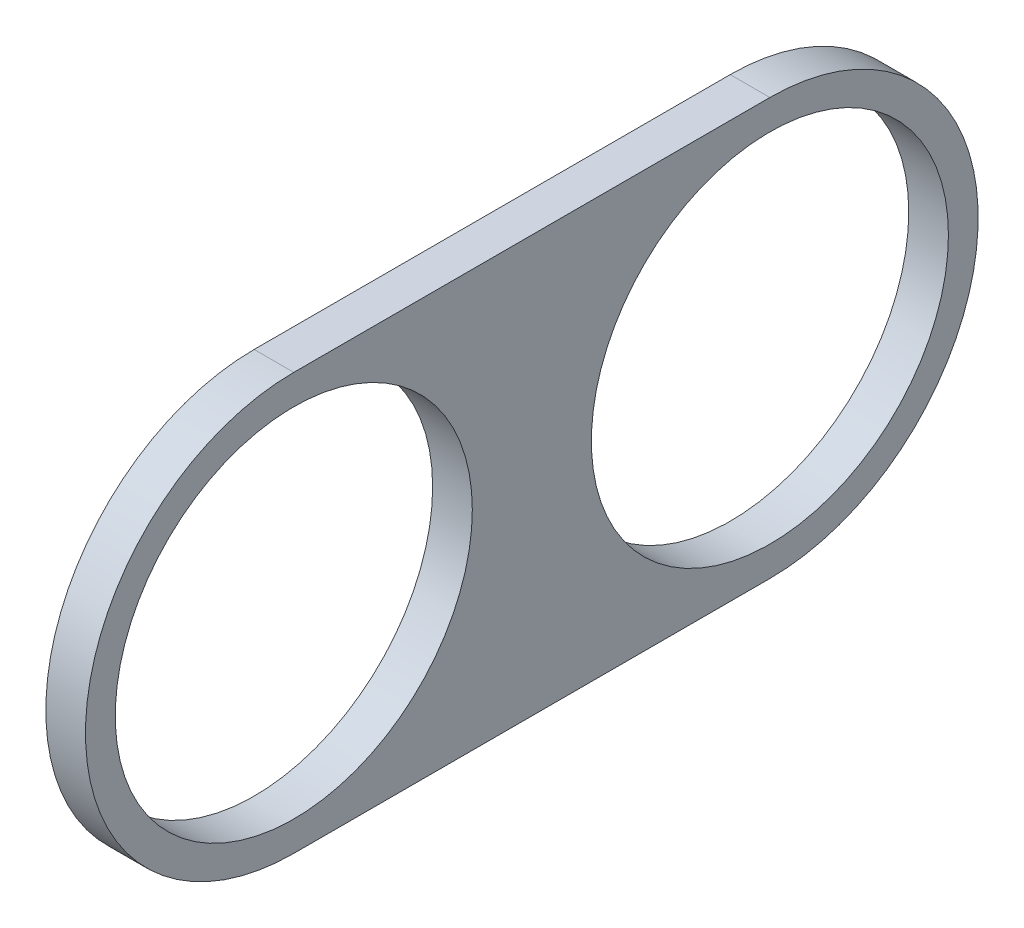
ISO-10303-21;
HEADER;
FILE_DESCRIPTION(('STEP AP214'),'2;1');
FILE_NAME('part.step','',(''),(''),'','','');
FILE_SCHEMA(('AUTOMOTIVE_DESIGN { 1 0 10303 214 1 1 1 1 }'));
ENDSEC;
DATA;
#1=APPLICATION_CONTEXT('core data for automotive mechanical design processes');
#2=APPLICATION_PROTOCOL_DEFINITION('international standard','automotive_design',2000,#1);
#3=PRODUCT_CONTEXT('',#1,'mechanical');
#4=PRODUCT('Part','Part','',(#3));
#5=PRODUCT_RELATED_PRODUCT_CATEGORY('part','',(#4));
#6=PRODUCT_DEFINITION_FORMATION('','',#4);
#7=PRODUCT_DEFINITION_CONTEXT('part definition',#1,'design');
#8=PRODUCT_DEFINITION('design','',#6,#7);
#9=PRODUCT_DEFINITION_SHAPE('','',#8);
#10=(LENGTH_UNIT() NAMED_UNIT(*) SI_UNIT(.MILLI.,.METRE.));
#11=(NAMED_UNIT(*) PLANE_ANGLE_UNIT() SI_UNIT($,.RADIAN.));
#12=(NAMED_UNIT(*) SI_UNIT($,.STERADIAN.) SOLID_ANGLE_UNIT());
#13=UNCERTAINTY_MEASURE_WITH_UNIT(LENGTH_MEASURE(1.E-05),#10,'distance_accuracy_value','');
#14=(GEOMETRIC_REPRESENTATION_CONTEXT(3) GLOBAL_UNCERTAINTY_ASSIGNED_CONTEXT((#13)) GLOBAL_UNIT_ASSIGNED_CONTEXT((#10,
#11,#12)) REPRESENTATION_CONTEXT('',''));
#15=CARTESIAN_POINT('',(0.,0.,0.));
#16=DIRECTION('',(0.,0.,1.));
#17=DIRECTION('',(1.,0.,0.));
#18=AXIS2_PLACEMENT_3D('',#15,#16,#17);
#19=CARTESIAN_POINT('',(3.175,0.,19.05));
#20=DIRECTION('',(1.,0.,0.));
#21=DIRECTION('',(0.,0.,-1.));
#22=AXIS2_PLACEMENT_3D('',#19,#20,#21);
#23=PLANE('',#22);
#24=CARTESIAN_POINT('',(3.175,0.,-19.05));
#25=DIRECTION('',(1.,0.,0.));
#26=DIRECTION('',(0.,0.,-1.));
#27=AXIS2_PLACEMENT_3D('',#24,#25,#26);
#28=CIRCLE('',#27,14.2875);
#29=CARTESIAN_POINT('',(3.175,0.,-33.3375));
#30=VERTEX_POINT('',#29);
#31=EDGE_CURVE('E109',#30,#30,#28,.T.);
#32=ORIENTED_EDGE('',*,*,#31,.F.);
#33=EDGE_LOOP('',(#32));
#34=FACE_BOUND('',#33,.T.);
#35=CARTESIAN_POINT('',(3.175,0.,19.05));
#36=DIRECTION('',(1.,0.,0.));
#37=DIRECTION('',(0.,0.,-1.));
#38=AXIS2_PLACEMENT_3D('',#35,#36,#37);
#39=CIRCLE('',#38,16.66875);
#40=CARTESIAN_POINT('',(3.175,16.66875,19.05));
#41=VERTEX_POINT('',#40);
#42=CARTESIAN_POINT('',(3.175,-16.66875,19.05));
#43=VERTEX_POINT('',#42);
#44=EDGE_CURVE('E94',#41,#43,#39,.T.);
#45=ORIENTED_EDGE('',*,*,#44,.T.);
#46=DIRECTION('',(0.,0.,-1.));
#47=VECTOR('',#46,1.);
#48=CARTESIAN_POINT('',(3.175,-16.66875,19.05));
#49=LINE('',#48,#47);
#50=CARTESIAN_POINT('',(3.175,-16.66875,-19.05));
#51=VERTEX_POINT('',#50);
#52=EDGE_CURVE('E89',#43,#51,#49,.T.);
#53=ORIENTED_EDGE('',*,*,#52,.T.);
#54=CARTESIAN_POINT('',(3.175,0.,-19.05));
#55=DIRECTION('',(1.,0.,0.));
#56=DIRECTION('',(0.,0.,-1.));
#57=AXIS2_PLACEMENT_3D('',#54,#55,#56);
#58=CIRCLE('',#57,16.66875);
#59=CARTESIAN_POINT('',(3.175,16.66875,-19.05));
#60=VERTEX_POINT('',#59);
#61=EDGE_CURVE('E92',#51,#60,#58,.T.);
#62=ORIENTED_EDGE('',*,*,#61,.T.);
#63=DIRECTION('',(0.,0.,1.));
#64=VECTOR('',#63,1.);
#65=CARTESIAN_POINT('',(3.175,16.66875,19.05));
#66=LINE('',#65,#64);
#67=EDGE_CURVE('E59',#60,#41,#66,.T.);
#68=ORIENTED_EDGE('',*,*,#67,.T.);
#69=EDGE_LOOP('',(#45,#53,#62,#68));
#70=FACE_BOUND('',#69,.T.);
#71=CARTESIAN_POINT('',(3.175,0.,19.05));
#72=DIRECTION('',(1.,0.,0.));
#73=DIRECTION('',(0.,0.,-1.));
#74=AXIS2_PLACEMENT_3D('',#71,#72,#73);
#75=CIRCLE('',#74,14.2875);
#76=CARTESIAN_POINT('',(3.175,0.,4.76250000000001));
#77=VERTEX_POINT('',#76);
#78=EDGE_CURVE('E124',#77,#77,#75,.T.);
#79=ORIENTED_EDGE('',*,*,#78,.F.);
#80=EDGE_LOOP('',(#79));
#81=FACE_BOUND('',#80,.T.);
#82=ADVANCED_FACE('F42',(#34,#70,#81),#23,.T.);
#83=CARTESIAN_POINT('',(0.,0.,19.05));
#84=DIRECTION('',(1.,0.,0.));
#85=DIRECTION('',(0.,0.,-1.));
#86=AXIS2_PLACEMENT_3D('',#83,#84,#85);
#87=PLANE('',#86);
#88=CARTESIAN_POINT('',(0.,0.,19.05));
#89=DIRECTION('',(1.,0.,0.));
#90=DIRECTION('',(0.,0.,-1.));
#91=AXIS2_PLACEMENT_3D('',#88,#89,#90);
#92=CIRCLE('',#91,16.66875);
#93=CARTESIAN_POINT('',(0.,16.66875,19.05));
#94=VERTEX_POINT('',#93);
#95=CARTESIAN_POINT('',(0.,-16.66875,19.05));
#96=VERTEX_POINT('',#95);
#97=EDGE_CURVE('E106',#94,#96,#92,.T.);
#98=ORIENTED_EDGE('',*,*,#97,.F.);
#99=DIRECTION('',(0.,0.,1.));
#100=VECTOR('',#99,1.);
#101=CARTESIAN_POINT('',(0.,16.66875,19.05));
#102=LINE('',#101,#100);
#103=CARTESIAN_POINT('',(0.,16.66875,-19.05));
#104=VERTEX_POINT('',#103);
#105=EDGE_CURVE('E82',#104,#94,#102,.T.);
#106=ORIENTED_EDGE('',*,*,#105,.F.);
#107=CARTESIAN_POINT('',(0.,0.,-19.05));
#108=DIRECTION('',(1.,0.,0.));
#109=DIRECTION('',(0.,0.,-1.));
#110=AXIS2_PLACEMENT_3D('',#107,#108,#109);
#111=CIRCLE('',#110,16.66875);
#112=CARTESIAN_POINT('',(0.,-16.66875,-19.05));
#113=VERTEX_POINT('',#112);
#114=EDGE_CURVE('E76',#113,#104,#111,.T.);
#115=ORIENTED_EDGE('',*,*,#114,.F.);
#116=DIRECTION('',(0.,0.,-1.));
#117=VECTOR('',#116,1.);
#118=CARTESIAN_POINT('',(0.,-16.66875,19.05));
#119=LINE('',#118,#117);
#120=EDGE_CURVE('E98',#96,#113,#119,.T.);
#121=ORIENTED_EDGE('',*,*,#120,.F.);
#122=EDGE_LOOP('',(#98,#106,#115,#121));
#123=FACE_BOUND('',#122,.T.);
#124=CARTESIAN_POINT('',(0.,0.,-19.05));
#125=DIRECTION('',(1.,0.,0.));
#126=DIRECTION('',(0.,0.,-1.));
#127=AXIS2_PLACEMENT_3D('',#124,#125,#126);
#128=CIRCLE('',#127,14.2875);
#129=CARTESIAN_POINT('',(0.,0.,-33.3375));
#130=VERTEX_POINT('',#129);
#131=EDGE_CURVE('E121',#130,#130,#128,.T.);
#132=ORIENTED_EDGE('',*,*,#131,.T.);
#133=EDGE_LOOP('',(#132));
#134=FACE_BOUND('',#133,.T.);
#135=CARTESIAN_POINT('',(0.,0.,19.05));
#136=DIRECTION('',(1.,0.,0.));
#137=DIRECTION('',(0.,0.,-1.));
#138=AXIS2_PLACEMENT_3D('',#135,#136,#137);
#139=CIRCLE('',#138,14.2875);
#140=CARTESIAN_POINT('',(0.,0.,4.76250000000001));
#141=VERTEX_POINT('',#140);
#142=EDGE_CURVE('E127',#141,#141,#139,.T.);
#143=ORIENTED_EDGE('',*,*,#142,.T.);
#144=EDGE_LOOP('',(#143));
#145=FACE_BOUND('',#144,.T.);
#146=ADVANCED_FACE('F117',(#123,#134,#145),#87,.F.);
#147=CARTESIAN_POINT('',(3.175,0.,19.05));
#148=DIRECTION('',(-1.,0.,0.));
#149=DIRECTION('',(0.,0.,1.));
#150=AXIS2_PLACEMENT_3D('',#147,#148,#149);
#151=CYLINDRICAL_SURFACE('',#150,16.66875);
#152=ORIENTED_EDGE('',*,*,#97,.T.);
#153=DIRECTION('',(-1.,0.,0.));
#154=VECTOR('',#153,1.);
#155=CARTESIAN_POINT('',(3.175,-16.66875,19.05));
#156=LINE('',#155,#154);
#157=EDGE_CURVE('E11',#43,#96,#156,.T.);
#158=ORIENTED_EDGE('',*,*,#157,.F.);
#159=ORIENTED_EDGE('',*,*,#44,.F.);
#160=DIRECTION('',(-1.,0.,0.));
#161=VECTOR('',#160,1.);
#162=CARTESIAN_POINT('',(3.175,16.66875,19.05));
#163=LINE('',#162,#161);
#164=EDGE_CURVE('E102',#41,#94,#163,.T.);
#165=ORIENTED_EDGE('',*,*,#164,.T.);
#166=EDGE_LOOP('',(#152,#158,#159,#165));
#167=FACE_BOUND('',#166,.T.);
#168=ADVANCED_FACE('F44',(#167),#151,.T.);
#169=CARTESIAN_POINT('',(3.175,-16.66875,19.05));
#170=DIRECTION('',(0.,1.,0.));
#171=DIRECTION('',(0.,0.,1.));
#172=AXIS2_PLACEMENT_3D('',#169,#170,#171);
#173=PLANE('',#172);
#174=ORIENTED_EDGE('',*,*,#120,.T.);
#175=DIRECTION('',(-1.,0.,0.));
#176=VECTOR('',#175,1.);
#177=CARTESIAN_POINT('',(3.175,-16.66875,-19.05));
#178=LINE('',#177,#176);
#179=EDGE_CURVE('E51',#51,#113,#178,.T.);
#180=ORIENTED_EDGE('',*,*,#179,.F.);
#181=ORIENTED_EDGE('',*,*,#52,.F.);
#182=ORIENTED_EDGE('',*,*,#157,.T.);
#183=EDGE_LOOP('',(#174,#180,#181,#182));
#184=FACE_BOUND('',#183,.T.);
#185=ADVANCED_FACE('F97',(#184),#173,.F.);
#186=CARTESIAN_POINT('',(3.175,0.,-19.05));
#187=DIRECTION('',(-1.,0.,0.));
#188=DIRECTION('',(0.,0.,1.));
#189=AXIS2_PLACEMENT_3D('',#186,#187,#188);
#190=CYLINDRICAL_SURFACE('',#189,16.66875);
#191=ORIENTED_EDGE('',*,*,#114,.T.);
#192=DIRECTION('',(-1.,0.,0.));
#193=VECTOR('',#192,1.);
#194=CARTESIAN_POINT('',(3.175,16.66875,-19.05));
#195=LINE('',#194,#193);
#196=EDGE_CURVE('E99',#60,#104,#195,.T.);
#197=ORIENTED_EDGE('',*,*,#196,.F.);
#198=ORIENTED_EDGE('',*,*,#61,.F.);
#199=ORIENTED_EDGE('',*,*,#179,.T.);
#200=EDGE_LOOP('',(#191,#197,#198,#199));
#201=FACE_BOUND('',#200,.T.);
#202=ADVANCED_FACE('F100',(#201),#190,.T.);
#203=CARTESIAN_POINT('',(3.175,16.66875,19.05));
#204=DIRECTION('',(0.,-1.,0.));
#205=DIRECTION('',(0.,0.,-1.));
#206=AXIS2_PLACEMENT_3D('',#203,#204,#205);
#207=PLANE('',#206);
#208=ORIENTED_EDGE('',*,*,#105,.T.);
#209=ORIENTED_EDGE('',*,*,#164,.F.);
#210=ORIENTED_EDGE('',*,*,#67,.F.);
#211=ORIENTED_EDGE('',*,*,#196,.T.);
#212=EDGE_LOOP('',(#208,#209,#210,#211));
#213=FACE_BOUND('',#212,.T.);
#214=ADVANCED_FACE('F114',(#213),#207,.F.);
#215=CARTESIAN_POINT('',(3.175,0.,-19.05));
#216=DIRECTION('',(-1.,0.,0.));
#217=DIRECTION('',(0.,0.,1.));
#218=AXIS2_PLACEMENT_3D('',#215,#216,#217);
#219=CYLINDRICAL_SURFACE('',#218,14.2875);
#220=ORIENTED_EDGE('',*,*,#31,.T.);
#221=EDGE_LOOP('',(#220));
#222=FACE_BOUND('',#221,.T.);
#223=ORIENTED_EDGE('',*,*,#131,.F.);
#224=EDGE_LOOP('',(#223));
#225=FACE_BOUND('',#224,.T.);
#226=ADVANCED_FACE('F144',(#222,#225),#219,.F.);
#227=CARTESIAN_POINT('',(3.175,0.,19.05));
#228=DIRECTION('',(-1.,0.,0.));
#229=DIRECTION('',(0.,0.,1.));
#230=AXIS2_PLACEMENT_3D('',#227,#228,#229);
#231=CYLINDRICAL_SURFACE('',#230,14.2875);
#232=ORIENTED_EDGE('',*,*,#78,.T.);
#233=EDGE_LOOP('',(#232));
#234=FACE_BOUND('',#233,.T.);
#235=ORIENTED_EDGE('',*,*,#142,.F.);
#236=EDGE_LOOP('',(#235));
#237=FACE_BOUND('',#236,.T.);
#238=ADVANCED_FACE('F133',(#234,#237),#231,.F.);
#239=CLOSED_SHELL('',(#82,#146,#168,#185,#202,#214,#226,#238));
#240=MANIFOLD_SOLID_BREP('B2',#239);
#241=ADVANCED_BREP_SHAPE_REPRESENTATION('',(#18,#240),#14);
#242=SHAPE_DEFINITION_REPRESENTATION(#9,#241);
ENDSEC;
END-ISO-10303-21;
